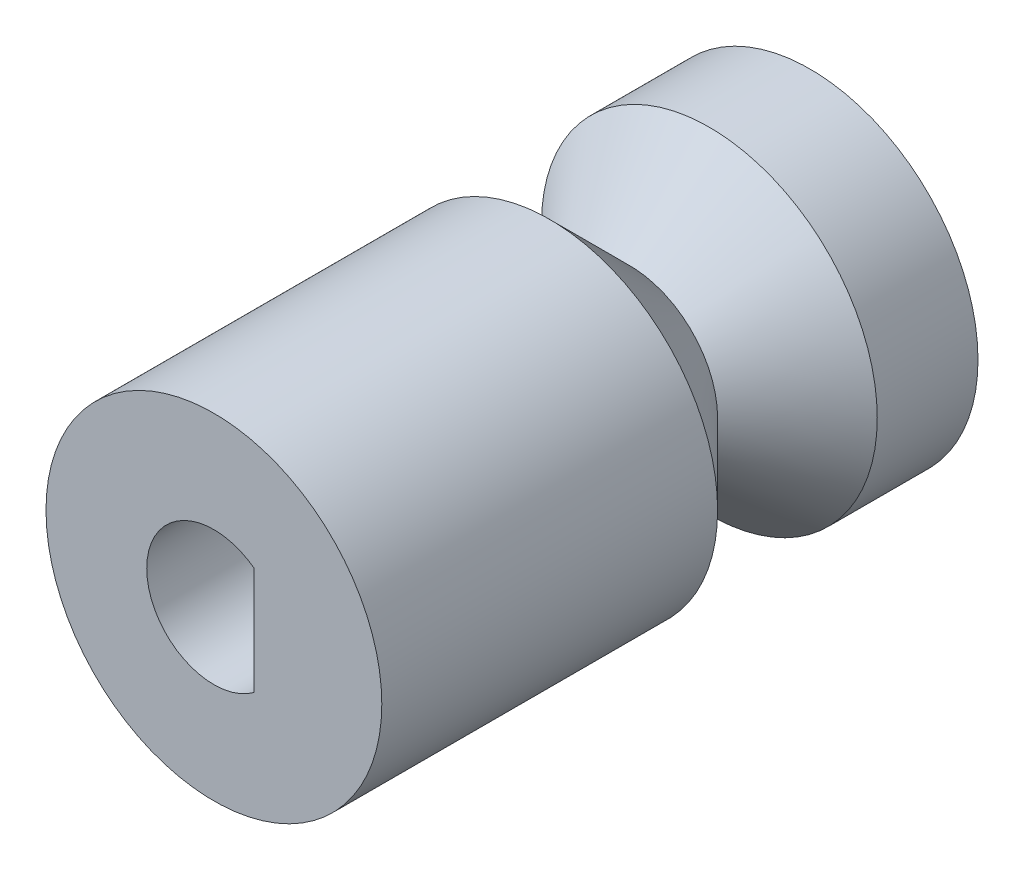
ISO-10303-21;
HEADER;
FILE_DESCRIPTION(('STEP AP214'),'2;1');
FILE_NAME('part.step','',(''),(''),'','','');
FILE_SCHEMA(('AUTOMOTIVE_DESIGN { 1 0 10303 214 1 1 1 1 }'));
ENDSEC;
DATA;
#1=APPLICATION_CONTEXT('core data for automotive mechanical design processes');
#2=APPLICATION_PROTOCOL_DEFINITION('international standard','automotive_design',2000,#1);
#3=PRODUCT_CONTEXT('',#1,'mechanical');
#4=PRODUCT('Part','Part','',(#3));
#5=PRODUCT_RELATED_PRODUCT_CATEGORY('part','',(#4));
#6=PRODUCT_DEFINITION_FORMATION('','',#4);
#7=PRODUCT_DEFINITION_CONTEXT('part definition',#1,'design');
#8=PRODUCT_DEFINITION('design','',#6,#7);
#9=PRODUCT_DEFINITION_SHAPE('','',#8);
#10=(LENGTH_UNIT() NAMED_UNIT(*) SI_UNIT(.MILLI.,.METRE.));
#11=(NAMED_UNIT(*) PLANE_ANGLE_UNIT() SI_UNIT($,.RADIAN.));
#12=(NAMED_UNIT(*) SI_UNIT($,.STERADIAN.) SOLID_ANGLE_UNIT());
#13=UNCERTAINTY_MEASURE_WITH_UNIT(LENGTH_MEASURE(1.E-05),#10,'distance_accuracy_value','');
#14=(GEOMETRIC_REPRESENTATION_CONTEXT(3) GLOBAL_UNCERTAINTY_ASSIGNED_CONTEXT((#13)) GLOBAL_UNIT_ASSIGNED_CONTEXT((#10,
#11,#12)) REPRESENTATION_CONTEXT('',''));
#15=CARTESIAN_POINT('',(0.,0.,0.));
#16=DIRECTION('',(0.,0.,1.));
#17=DIRECTION('',(1.,0.,0.));
#18=AXIS2_PLACEMENT_3D('',#15,#16,#17);
#19=CARTESIAN_POINT('',(0.,0.,10.));
#20=DIRECTION('',(0.,0.,1.));
#21=DIRECTION('',(1.,0.,0.));
#22=AXIS2_PLACEMENT_3D('',#19,#20,#21);
#23=PLANE('',#22);
#24=CARTESIAN_POINT('',(0.,0.,10.));
#25=DIRECTION('',(0.,0.,1.));
#26=DIRECTION('',(1.,0.,0.));
#27=AXIS2_PLACEMENT_3D('',#24,#25,#26);
#28=CIRCLE('',#27,5.);
#29=CARTESIAN_POINT('',(5.,0.,10.));
#30=VERTEX_POINT('',#29);
#31=EDGE_CURVE('E11',#30,#30,#28,.T.);
#32=ORIENTED_EDGE('',*,*,#31,.T.);
#33=EDGE_LOOP('',(#32));
#34=FACE_BOUND('',#33,.T.);
#35=DIRECTION('',(0.,1.,0.));
#36=VECTOR('',#35,1.);
#37=CARTESIAN_POINT('',(1.2,1.6,10.));
#38=LINE('',#37,#36);
#39=CARTESIAN_POINT('',(1.2,-1.6,10.));
#40=VERTEX_POINT('',#39);
#41=CARTESIAN_POINT('',(1.2,1.6,10.));
#42=VERTEX_POINT('',#41);
#43=EDGE_CURVE('E53',#40,#42,#38,.T.);
#44=ORIENTED_EDGE('',*,*,#43,.F.);
#45=CARTESIAN_POINT('',(0.,0.,10.));
#46=DIRECTION('',(0.,0.,1.));
#47=DIRECTION('',(1.,0.,0.));
#48=AXIS2_PLACEMENT_3D('',#45,#46,#47);
#49=CIRCLE('',#48,2.);
#50=EDGE_CURVE('E72',#42,#40,#49,.T.);
#51=ORIENTED_EDGE('',*,*,#50,.F.);
#52=EDGE_LOOP('',(#44,#51));
#53=FACE_BOUND('',#52,.T.);
#54=ADVANCED_FACE('F33',(#34,#53),#23,.T.);
#55=CARTESIAN_POINT('',(0.,0.,10.));
#56=DIRECTION('',(0.,0.,-1.));
#57=DIRECTION('',(-1.,0.,0.));
#58=AXIS2_PLACEMENT_3D('',#55,#56,#57);
#59=CYLINDRICAL_SURFACE('',#58,5.);
#60=ORIENTED_EDGE('',*,*,#31,.F.);
#61=EDGE_LOOP('',(#60));
#62=FACE_BOUND('',#61,.T.);
#63=CARTESIAN_POINT('',(0.,0.,0.));
#64=DIRECTION('',(0.,0.,1.));
#65=DIRECTION('',(1.,0.,0.));
#66=AXIS2_PLACEMENT_3D('',#63,#64,#65);
#67=CIRCLE('',#66,5.);
#68=CARTESIAN_POINT('',(5.,0.,0.));
#69=VERTEX_POINT('',#68);
#70=EDGE_CURVE('E69',#69,#69,#67,.T.);
#71=ORIENTED_EDGE('',*,*,#70,.T.);
#72=EDGE_LOOP('',(#71));
#73=FACE_BOUND('',#72,.T.);
#74=ADVANCED_FACE('F35',(#62,#73),#59,.T.);
#75=CARTESIAN_POINT('',(0.,0.,10.));
#76=DIRECTION('',(0.,0.,-1.));
#77=DIRECTION('',(-1.,0.,0.));
#78=AXIS2_PLACEMENT_3D('',#75,#76,#77);
#79=CYLINDRICAL_SURFACE('',#78,2.);
#80=CARTESIAN_POINT('',(0.,0.,0.));
#81=DIRECTION('',(0.,0.,1.));
#82=DIRECTION('',(1.,0.,0.));
#83=AXIS2_PLACEMENT_3D('',#80,#81,#82);
#84=CIRCLE('',#83,2.);
#85=CARTESIAN_POINT('',(1.2,1.6,0.));
#86=VERTEX_POINT('',#85);
#87=CARTESIAN_POINT('',(1.2,-1.6,0.));
#88=VERTEX_POINT('',#87);
#89=EDGE_CURVE('E66',#86,#88,#84,.T.);
#90=ORIENTED_EDGE('',*,*,#89,.F.);
#91=DIRECTION('',(0.,0.,-1.));
#92=VECTOR('',#91,1.);
#93=CARTESIAN_POINT('',(1.2,1.6,10.));
#94=LINE('',#93,#92);
#95=EDGE_CURVE('E57',#42,#86,#94,.T.);
#96=ORIENTED_EDGE('',*,*,#95,.F.);
#97=ORIENTED_EDGE('',*,*,#50,.T.);
#98=DIRECTION('',(0.,0.,-1.));
#99=VECTOR('',#98,1.);
#100=CARTESIAN_POINT('',(1.2,-1.6,10.));
#101=LINE('',#100,#99);
#102=EDGE_CURVE('E41',#40,#88,#101,.T.);
#103=ORIENTED_EDGE('',*,*,#102,.T.);
#104=EDGE_LOOP('',(#90,#96,#97,#103));
#105=FACE_BOUND('',#104,.T.);
#106=ADVANCED_FACE('F67',(#105),#79,.F.);
#107=CARTESIAN_POINT('',(1.2,1.6,10.));
#108=DIRECTION('',(-1.,0.,0.));
#109=DIRECTION('',(0.,0.,1.));
#110=AXIS2_PLACEMENT_3D('',#107,#108,#109);
#111=PLANE('',#110);
#112=DIRECTION('',(0.,1.,0.));
#113=VECTOR('',#112,1.);
#114=CARTESIAN_POINT('',(1.2,1.6,0.));
#115=LINE('',#114,#113);
#116=EDGE_CURVE('E61',#88,#86,#115,.T.);
#117=ORIENTED_EDGE('',*,*,#116,.F.);
#118=ORIENTED_EDGE('',*,*,#102,.F.);
#119=ORIENTED_EDGE('',*,*,#43,.T.);
#120=ORIENTED_EDGE('',*,*,#95,.T.);
#121=EDGE_LOOP('',(#117,#118,#119,#120));
#122=FACE_BOUND('',#121,.T.);
#123=ADVANCED_FACE('F59',(#122),#111,.T.);
#124=CARTESIAN_POINT('',(0.,0.,0.));
#125=DIRECTION('',(0.,0.,1.));
#126=DIRECTION('',(1.,0.,0.));
#127=AXIS2_PLACEMENT_3D('',#124,#125,#126);
#128=PLANE('',#127);
#129=ORIENTED_EDGE('',*,*,#116,.T.);
#130=ORIENTED_EDGE('',*,*,#89,.T.);
#131=EDGE_LOOP('',(#129,#130));
#132=FACE_BOUND('',#131,.T.);
#133=ADVANCED_FACE('F71',(#132),#128,.T.);
#134=CARTESIAN_POINT('',(0.,0.,0.));
#135=DIRECTION('',(0.,0.,1.));
#136=DIRECTION('',(1.,0.,0.));
#137=AXIS2_PLACEMENT_3D('',#134,#135,#136);
#138=CONICAL_SURFACE('',#137,5.,0.785398163397454);
#139=CARTESIAN_POINT('',(0.,0.,-2.3771431076911));
#140=DIRECTION('',(0.,0.,1.));
#141=DIRECTION('',(1.,0.,0.));
#142=AXIS2_PLACEMENT_3D('',#139,#140,#141);
#143=CIRCLE('',#142,2.62285689230887);
#144=CARTESIAN_POINT('',(2.62285689230887,0.,-2.3771431076911));
#145=VERTEX_POINT('',#144);
#146=EDGE_CURVE('E79',#145,#145,#143,.T.);
#147=ORIENTED_EDGE('',*,*,#146,.T.);
#148=EDGE_LOOP('',(#147));
#149=FACE_BOUND('',#148,.T.);
#150=ORIENTED_EDGE('',*,*,#70,.F.);
#151=EDGE_LOOP('',(#150));
#152=FACE_BOUND('',#151,.T.);
#153=ADVANCED_FACE('F100',(#149,#152),#138,.T.);
#154=CARTESIAN_POINT('',(0.,0.,-2.3771431076911));
#155=DIRECTION('',(0.,0.,-1.));
#156=DIRECTION('',(-1.,0.,0.));
#157=AXIS2_PLACEMENT_3D('',#154,#155,#156);
#158=CONICAL_SURFACE('',#157,2.62285689230887,0.785398163397443);
#159=CARTESIAN_POINT('',(0.,0.,-4.75428621538225));
#160=DIRECTION('',(0.,0.,-1.));
#161=DIRECTION('',(-1.,0.,0.));
#162=AXIS2_PLACEMENT_3D('',#159,#160,#161);
#163=CIRCLE('',#162,5.);
#164=CARTESIAN_POINT('',(-5.,0.,-4.75428621538225));
#165=VERTEX_POINT('',#164);
#166=EDGE_CURVE('E83',#165,#165,#163,.T.);
#167=ORIENTED_EDGE('',*,*,#166,.F.);
#168=EDGE_LOOP('',(#167));
#169=FACE_BOUND('',#168,.T.);
#170=ORIENTED_EDGE('',*,*,#146,.F.);
#171=EDGE_LOOP('',(#170));
#172=FACE_BOUND('',#171,.T.);
#173=ADVANCED_FACE('F94',(#169,#172),#158,.T.);
#174=CARTESIAN_POINT('',(0.,0.,-7.75428621538225));
#175=DIRECTION('',(0.,0.,1.));
#176=DIRECTION('',(1.,0.,0.));
#177=AXIS2_PLACEMENT_3D('',#174,#175,#176);
#178=CYLINDRICAL_SURFACE('',#177,5.);
#179=CARTESIAN_POINT('',(0.,0.,-7.75428621538225));
#180=DIRECTION('',(0.,0.,-1.));
#181=DIRECTION('',(-1.,0.,0.));
#182=AXIS2_PLACEMENT_3D('',#179,#180,#181);
#183=CIRCLE('',#182,5.);
#184=CARTESIAN_POINT('',(-5.,0.,-7.75428621538225));
#185=VERTEX_POINT('',#184);
#186=EDGE_CURVE('E82',#185,#185,#183,.T.);
#187=ORIENTED_EDGE('',*,*,#186,.F.);
#188=EDGE_LOOP('',(#187));
#189=FACE_BOUND('',#188,.T.);
#190=ORIENTED_EDGE('',*,*,#166,.T.);
#191=EDGE_LOOP('',(#190));
#192=FACE_BOUND('',#191,.T.);
#193=ADVANCED_FACE('F91',(#189,#192),#178,.T.);
#194=CARTESIAN_POINT('',(0.,0.,-7.75428621538225));
#195=DIRECTION('',(0.,0.,-1.));
#196=DIRECTION('',(-1.,0.,0.));
#197=AXIS2_PLACEMENT_3D('',#194,#195,#196);
#198=PLANE('',#197);
#199=ORIENTED_EDGE('',*,*,#186,.T.);
#200=EDGE_LOOP('',(#199));
#201=FACE_BOUND('',#200,.T.);
#202=ADVANCED_FACE('F89',(#201),#198,.T.);
#203=CLOSED_SHELL('',(#54,#74,#106,#123,#133,#153,#173,#193,#202));
#204=MANIFOLD_SOLID_BREP('B2',#203);
#205=ADVANCED_BREP_SHAPE_REPRESENTATION('',(#18,#204),#14);
#206=SHAPE_DEFINITION_REPRESENTATION(#9,#205);
ENDSEC;
END-ISO-10303-21;
